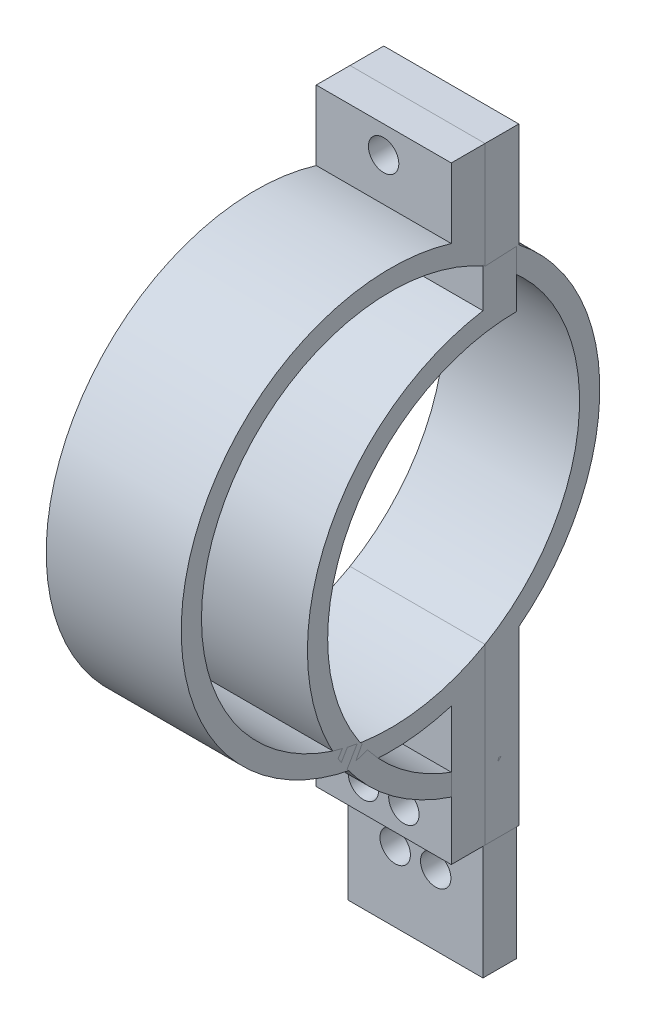
ISO-10303-21;
HEADER;
FILE_DESCRIPTION(('STEP AP214'),'2;1');
FILE_NAME('part.step','',(''),(''),'','','');
FILE_SCHEMA(('AUTOMOTIVE_DESIGN { 1 0 10303 214 1 1 1 1 }'));
ENDSEC;
DATA;
#1=APPLICATION_CONTEXT('core data for automotive mechanical design processes');
#2=APPLICATION_PROTOCOL_DEFINITION('international standard','automotive_design',2000,#1);
#3=PRODUCT_CONTEXT('',#1,'mechanical');
#4=PRODUCT('Part','Part','',(#3));
#5=PRODUCT_RELATED_PRODUCT_CATEGORY('part','',(#4));
#6=PRODUCT_DEFINITION_FORMATION('','',#4);
#7=PRODUCT_DEFINITION_CONTEXT('part definition',#1,'design');
#8=PRODUCT_DEFINITION('design','',#6,#7);
#9=PRODUCT_DEFINITION_SHAPE('','',#8);
#10=(LENGTH_UNIT() NAMED_UNIT(*) SI_UNIT(.MILLI.,.METRE.));
#11=(NAMED_UNIT(*) PLANE_ANGLE_UNIT() SI_UNIT($,.RADIAN.));
#12=(NAMED_UNIT(*) SI_UNIT($,.STERADIAN.) SOLID_ANGLE_UNIT());
#13=UNCERTAINTY_MEASURE_WITH_UNIT(LENGTH_MEASURE(1.E-05),#10,'distance_accuracy_value','');
#14=(GEOMETRIC_REPRESENTATION_CONTEXT(3) GLOBAL_UNCERTAINTY_ASSIGNED_CONTEXT((#13)) GLOBAL_UNIT_ASSIGNED_CONTEXT((#10,
#11,#12)) REPRESENTATION_CONTEXT('',''));
#15=CARTESIAN_POINT('',(0.,0.,0.));
#16=DIRECTION('',(0.,0.,1.));
#17=DIRECTION('',(1.,0.,0.));
#18=AXIS2_PLACEMENT_3D('',#15,#16,#17);
#19=CARTESIAN_POINT('',(20.,0.,4.69181112515571));
#20=DIRECTION('',(0.,0.,-1.));
#21=DIRECTION('',(-1.,0.,0.));
#22=AXIS2_PLACEMENT_3D('',#19,#20,#21);
#23=PLANE('',#22);
#24=CARTESIAN_POINT('',(9.97943321751738,47.895945659677,4.69181112515571));
#25=DIRECTION('',(0.,0.,-1.));
#26=DIRECTION('',(-1.,0.,0.));
#27=AXIS2_PLACEMENT_3D('',#24,#25,#26);
#28=CIRCLE('',#27,2.25);
#29=CARTESIAN_POINT('',(7.72943321751738,47.895945659677,4.69181112515571));
#30=VERTEX_POINT('',#29);
#31=EDGE_CURVE('E185',#30,#30,#28,.T.);
#32=ORIENTED_EDGE('',*,*,#31,.T.);
#33=EDGE_LOOP('',(#32));
#34=FACE_BOUND('',#33,.T.);
#35=DIRECTION('',(0.,-1.,0.));
#36=VECTOR('',#35,1.);
#37=CARTESIAN_POINT('',(0.,0.,4.69181112515571));
#38=LINE('',#37,#36);
#39=CARTESIAN_POINT('',(0.,51.895945659677,4.69181112515571));
#40=VERTEX_POINT('',#39);
#41=CARTESIAN_POINT('',(0.,36.1446569656412,4.69181112515571));
#42=VERTEX_POINT('',#41);
#43=EDGE_CURVE('E155',#40,#42,#38,.T.);
#44=ORIENTED_EDGE('',*,*,#43,.T.);
#45=DIRECTION('',(-1.,0.,0.));
#46=VECTOR('',#45,1.);
#47=CARTESIAN_POINT('',(20.,36.1446569656412,4.69181112515571));
#48=LINE('',#47,#46);
#49=CARTESIAN_POINT('',(20.,36.1446569656412,4.69181112515571));
#50=VERTEX_POINT('',#49);
#51=EDGE_CURVE('E12',#50,#42,#48,.T.);
#52=ORIENTED_EDGE('',*,*,#51,.F.);
#53=DIRECTION('',(0.,-1.,0.));
#54=VECTOR('',#53,1.);
#55=CARTESIAN_POINT('',(20.,0.,4.69181112515571));
#56=LINE('',#55,#54);
#57=CARTESIAN_POINT('',(20.,51.895945659677,4.69181112515571));
#58=VERTEX_POINT('',#57);
#59=EDGE_CURVE('E114',#58,#50,#56,.T.);
#60=ORIENTED_EDGE('',*,*,#59,.F.);
#61=DIRECTION('',(-1.,0.,0.));
#62=VECTOR('',#61,1.);
#63=CARTESIAN_POINT('',(20.,51.895945659677,4.69181112515571));
#64=LINE('',#63,#62);
#65=EDGE_CURVE('E76',#58,#40,#64,.T.);
#66=ORIENTED_EDGE('',*,*,#65,.T.);
#67=EDGE_LOOP('',(#44,#52,#60,#66));
#68=FACE_BOUND('',#67,.T.);
#69=ADVANCED_FACE('F58',(#34,#68),#23,.F.);
#70=CARTESIAN_POINT('',(20.,11.895945659677,18.6918111251557));
#71=DIRECTION('',(-1.,0.,0.));
#72=DIRECTION('',(0.,0.,1.));
#73=AXIS2_PLACEMENT_3D('',#70,#71,#72);
#74=CYLINDRICAL_SURFACE('',#73,28.);
#75=CARTESIAN_POINT('',(0.,11.895945659677,18.6918111251557));
#76=DIRECTION('',(1.,0.,0.));
#77=DIRECTION('',(0.,0.,-1.));
#78=AXIS2_PLACEMENT_3D('',#75,#76,#77);
#79=CIRCLE('',#78,28.);
#80=CARTESIAN_POINT('',(0.,-12.3527656462873,4.69181112515571));
#81=VERTEX_POINT('',#80);
#82=EDGE_CURVE('E157',#81,#42,#79,.T.);
#83=ORIENTED_EDGE('',*,*,#82,.F.);
#84=DIRECTION('',(-1.,0.,0.));
#85=VECTOR('',#84,1.);
#86=CARTESIAN_POINT('',(20.,-12.3527656462873,4.69181112515571));
#87=LINE('',#86,#85);
#88=CARTESIAN_POINT('',(20.,-12.3527656462873,4.69181112515571));
#89=VERTEX_POINT('',#88);
#90=EDGE_CURVE('E67',#89,#81,#87,.T.);
#91=ORIENTED_EDGE('',*,*,#90,.F.);
#92=CARTESIAN_POINT('',(20.,11.895945659677,18.6918111251557));
#93=DIRECTION('',(1.,0.,0.));
#94=DIRECTION('',(0.,0.,-1.));
#95=AXIS2_PLACEMENT_3D('',#92,#93,#94);
#96=CIRCLE('',#95,28.);
#97=EDGE_CURVE('E201',#89,#50,#96,.T.);
#98=ORIENTED_EDGE('',*,*,#97,.T.);
#99=ORIENTED_EDGE('',*,*,#51,.T.);
#100=EDGE_LOOP('',(#83,#91,#98,#99));
#101=FACE_BOUND('',#100,.T.);
#102=ADVANCED_FACE('F232',(#101),#74,.F.);
#103=CARTESIAN_POINT('',(20.,0.,4.69181112515571));
#104=DIRECTION('',(0.,0.,-1.));
#105=DIRECTION('',(-1.,0.,0.));
#106=AXIS2_PLACEMENT_3D('',#103,#104,#105);
#107=PLANE('',#106);
#108=CARTESIAN_POINT('',(6.97943321751738,-34.0266817201343,4.69181112515571));
#109=DIRECTION('',(0.,0.,-1.));
#110=DIRECTION('',(-1.,0.,0.));
#111=AXIS2_PLACEMENT_3D('',#108,#109,#110);
#112=CIRCLE('',#111,2.25000000000001);
#113=CARTESIAN_POINT('',(4.72943321751738,-34.0266817201343,4.69181112515571));
#114=VERTEX_POINT('',#113);
#115=EDGE_CURVE('E158',#114,#114,#112,.T.);
#116=ORIENTED_EDGE('',*,*,#115,.T.);
#117=EDGE_LOOP('',(#116));
#118=FACE_BOUND('',#117,.T.);
#119=CARTESIAN_POINT('',(12.9794332175174,-34.104054340323,4.69181112515571));
#120=DIRECTION('',(0.,0.,-1.));
#121=DIRECTION('',(-1.,0.,0.));
#122=AXIS2_PLACEMENT_3D('',#119,#120,#121);
#123=CIRCLE('',#122,2.25);
#124=CARTESIAN_POINT('',(10.7294332175174,-34.104054340323,4.69181112515571));
#125=VERTEX_POINT('',#124);
#126=EDGE_CURVE('E188',#125,#125,#123,.T.);
#127=ORIENTED_EDGE('',*,*,#126,.T.);
#128=EDGE_LOOP('',(#127));
#129=FACE_BOUND('',#128,.T.);
#130=DIRECTION('',(0.,-1.,0.));
#131=VECTOR('',#130,1.);
#132=CARTESIAN_POINT('',(0.,0.,4.69181112515571));
#133=LINE('',#132,#131);
#134=CARTESIAN_POINT('',(0.,-38.104054340323,4.69181112515571));
#135=VERTEX_POINT('',#134);
#136=EDGE_CURVE('E161',#81,#135,#133,.T.);
#137=ORIENTED_EDGE('',*,*,#136,.T.);
#138=DIRECTION('',(-1.,0.,0.));
#139=VECTOR('',#138,1.);
#140=CARTESIAN_POINT('',(20.,-38.104054340323,4.69181112515571));
#141=LINE('',#140,#139);
#142=CARTESIAN_POINT('',(20.,-38.104054340323,4.69181112515571));
#143=VERTEX_POINT('',#142);
#144=EDGE_CURVE('E179',#143,#135,#141,.T.);
#145=ORIENTED_EDGE('',*,*,#144,.F.);
#146=DIRECTION('',(0.,-1.,0.));
#147=VECTOR('',#146,1.);
#148=CARTESIAN_POINT('',(20.,0.,4.69181112515571));
#149=LINE('',#148,#147);
#150=EDGE_CURVE('E204',#89,#143,#149,.T.);
#151=ORIENTED_EDGE('',*,*,#150,.F.);
#152=ORIENTED_EDGE('',*,*,#90,.T.);
#153=EDGE_LOOP('',(#137,#145,#151,#152));
#154=FACE_BOUND('',#153,.T.);
#155=ADVANCED_FACE('F238',(#118,#129,#154),#107,.F.);
#156=CARTESIAN_POINT('',(20.,-38.104054340323,0.));
#157=DIRECTION('',(0.,1.,0.));
#158=DIRECTION('',(0.,0.,1.));
#159=AXIS2_PLACEMENT_3D('',#156,#157,#158);
#160=PLANE('',#159);
#161=DIRECTION('',(0.,0.,-1.));
#162=VECTOR('',#161,1.);
#163=CARTESIAN_POINT('',(0.,-38.104054340323,0.));
#164=LINE('',#163,#162);
#165=CARTESIAN_POINT('',(0.,-38.104054340323,-0.308188874844293));
#166=VERTEX_POINT('',#165);
#167=EDGE_CURVE('E163',#135,#166,#164,.T.);
#168=ORIENTED_EDGE('',*,*,#167,.T.);
#169=DIRECTION('',(-1.,0.,0.));
#170=VECTOR('',#169,1.);
#171=CARTESIAN_POINT('',(20.,-38.104054340323,-0.308188874844293));
#172=LINE('',#171,#170);
#173=CARTESIAN_POINT('',(20.,-38.104054340323,-0.308188874844293));
#174=VERTEX_POINT('',#173);
#175=EDGE_CURVE('E176',#174,#166,#172,.T.);
#176=ORIENTED_EDGE('',*,*,#175,.F.);
#177=DIRECTION('',(0.,0.,-1.));
#178=VECTOR('',#177,1.);
#179=CARTESIAN_POINT('',(20.,-38.104054340323,0.));
#180=LINE('',#179,#178);
#181=EDGE_CURVE('E206',#143,#174,#180,.T.);
#182=ORIENTED_EDGE('',*,*,#181,.F.);
#183=ORIENTED_EDGE('',*,*,#144,.T.);
#184=EDGE_LOOP('',(#168,#176,#182,#183));
#185=FACE_BOUND('',#184,.T.);
#186=ADVANCED_FACE('F212',(#185),#160,.F.);
#187=CARTESIAN_POINT('',(20.,0.,-0.308188874844293));
#188=DIRECTION('',(0.,0.,1.));
#189=DIRECTION('',(1.,0.,0.));
#190=AXIS2_PLACEMENT_3D('',#187,#188,#189);
#191=PLANE('',#190);
#192=CARTESIAN_POINT('',(6.97943321751738,-34.0266817201343,-0.308188874844293));
#193=DIRECTION('',(0.,0.,1.));
#194=DIRECTION('',(1.,0.,0.));
#195=AXIS2_PLACEMENT_3D('',#192,#193,#194);
#196=CIRCLE('',#195,2.25000000000001);
#197=CARTESIAN_POINT('',(9.22943321751739,-34.0266817201343,-0.308188874844293));
#198=VERTEX_POINT('',#197);
#199=EDGE_CURVE('E61',#198,#198,#196,.T.);
#200=ORIENTED_EDGE('',*,*,#199,.T.);
#201=EDGE_LOOP('',(#200));
#202=FACE_BOUND('',#201,.T.);
#203=CARTESIAN_POINT('',(12.9794332175174,-34.104054340323,-0.308188874844293));
#204=DIRECTION('',(0.,0.,1.));
#205=DIRECTION('',(1.,0.,0.));
#206=AXIS2_PLACEMENT_3D('',#203,#204,#205);
#207=CIRCLE('',#206,2.25);
#208=CARTESIAN_POINT('',(15.2294332175174,-34.104054340323,-0.308188874844293));
#209=VERTEX_POINT('',#208);
#210=EDGE_CURVE('E186',#209,#209,#207,.T.);
#211=ORIENTED_EDGE('',*,*,#210,.T.);
#212=EDGE_LOOP('',(#211));
#213=FACE_BOUND('',#212,.T.);
#214=DIRECTION('',(0.,1.,0.));
#215=VECTOR('',#214,1.);
#216=CARTESIAN_POINT('',(0.,0.,-0.308188874844293));
#217=LINE('',#216,#215);
#218=CARTESIAN_POINT('',(0.,-12.5989517681548,-0.308188874844295));
#219=VERTEX_POINT('',#218);
#220=EDGE_CURVE('E165',#166,#219,#217,.T.);
#221=ORIENTED_EDGE('',*,*,#220,.T.);
#222=DIRECTION('',(-1.,0.,0.));
#223=VECTOR('',#222,1.);
#224=CARTESIAN_POINT('',(20.,-12.5989517681548,-0.308188874844295));
#225=LINE('',#224,#223);
#226=CARTESIAN_POINT('',(20.,-12.5989517681548,-0.308188874844295));
#227=VERTEX_POINT('',#226);
#228=EDGE_CURVE('E147',#227,#219,#225,.T.);
#229=ORIENTED_EDGE('',*,*,#228,.F.);
#230=DIRECTION('',(0.,1.,0.));
#231=VECTOR('',#230,1.);
#232=CARTESIAN_POINT('',(20.,0.,-0.308188874844293));
#233=LINE('',#232,#231);
#234=EDGE_CURVE('E135',#174,#227,#233,.T.);
#235=ORIENTED_EDGE('',*,*,#234,.F.);
#236=ORIENTED_EDGE('',*,*,#175,.T.);
#237=EDGE_LOOP('',(#221,#229,#235,#236));
#238=FACE_BOUND('',#237,.T.);
#239=ADVANCED_FACE('F216',(#202,#213,#238),#191,.F.);
#240=CARTESIAN_POINT('',(20.,11.895945659677,18.6918111251557));
#241=DIRECTION('',(-1.,0.,0.));
#242=DIRECTION('',(0.,0.,1.));
#243=AXIS2_PLACEMENT_3D('',#240,#241,#242);
#244=CYLINDRICAL_SURFACE('',#243,31.);
#245=CARTESIAN_POINT('',(0.,11.895945659677,18.6918111251557));
#246=DIRECTION('',(1.,0.,0.));
#247=DIRECTION('',(0.,0.,-1.));
#248=AXIS2_PLACEMENT_3D('',#245,#246,#247);
#249=CIRCLE('',#248,31.);
#250=CARTESIAN_POINT('',(0.,36.3908430875087,-0.308188874844295));
#251=VERTEX_POINT('',#250);
#252=EDGE_CURVE('E144',#219,#251,#249,.T.);
#253=ORIENTED_EDGE('',*,*,#252,.T.);
#254=DIRECTION('',(-1.,0.,0.));
#255=VECTOR('',#254,1.);
#256=CARTESIAN_POINT('',(20.,36.3908430875087,-0.308188874844295));
#257=LINE('',#256,#255);
#258=CARTESIAN_POINT('',(20.,36.3908430875087,-0.308188874844295));
#259=VERTEX_POINT('',#258);
#260=EDGE_CURVE('E141',#259,#251,#257,.T.);
#261=ORIENTED_EDGE('',*,*,#260,.F.);
#262=CARTESIAN_POINT('',(20.,11.895945659677,18.6918111251557));
#263=DIRECTION('',(1.,0.,0.));
#264=DIRECTION('',(0.,0.,-1.));
#265=AXIS2_PLACEMENT_3D('',#262,#263,#264);
#266=CIRCLE('',#265,31.);
#267=EDGE_CURVE('E129',#227,#259,#266,.T.);
#268=ORIENTED_EDGE('',*,*,#267,.F.);
#269=ORIENTED_EDGE('',*,*,#228,.T.);
#270=EDGE_LOOP('',(#253,#261,#268,#269));
#271=FACE_BOUND('',#270,.T.);
#272=ADVANCED_FACE('F142',(#271),#244,.T.);
#273=CARTESIAN_POINT('',(20.,0.,-0.308188874844293));
#274=DIRECTION('',(0.,0.,1.));
#275=DIRECTION('',(1.,0.,0.));
#276=AXIS2_PLACEMENT_3D('',#273,#274,#275);
#277=PLANE('',#276);
#278=CARTESIAN_POINT('',(9.97943321751738,47.895945659677,-0.308188874844293));
#279=DIRECTION('',(0.,0.,1.));
#280=DIRECTION('',(1.,0.,0.));
#281=AXIS2_PLACEMENT_3D('',#278,#279,#280);
#282=CIRCLE('',#281,2.25);
#283=CARTESIAN_POINT('',(12.2294332175174,47.895945659677,-0.308188874844293));
#284=VERTEX_POINT('',#283);
#285=EDGE_CURVE('E183',#284,#284,#282,.T.);
#286=ORIENTED_EDGE('',*,*,#285,.T.);
#287=EDGE_LOOP('',(#286));
#288=FACE_BOUND('',#287,.T.);
#289=DIRECTION('',(0.,1.,0.));
#290=VECTOR('',#289,1.);
#291=CARTESIAN_POINT('',(0.,0.,-0.308188874844293));
#292=LINE('',#291,#290);
#293=CARTESIAN_POINT('',(0.,51.895945659677,-0.308188874844293));
#294=VERTEX_POINT('',#293);
#295=EDGE_CURVE('E168',#251,#294,#292,.T.);
#296=ORIENTED_EDGE('',*,*,#295,.T.);
#297=DIRECTION('',(-1.,0.,0.));
#298=VECTOR('',#297,1.);
#299=CARTESIAN_POINT('',(20.,51.895945659677,-0.308188874844293));
#300=LINE('',#299,#298);
#301=CARTESIAN_POINT('',(20.,51.895945659677,-0.308188874844293));
#302=VERTEX_POINT('',#301);
#303=EDGE_CURVE('E102',#302,#294,#300,.T.);
#304=ORIENTED_EDGE('',*,*,#303,.F.);
#305=DIRECTION('',(0.,1.,0.));
#306=VECTOR('',#305,1.);
#307=CARTESIAN_POINT('',(20.,0.,-0.308188874844293));
#308=LINE('',#307,#306);
#309=EDGE_CURVE('E133',#259,#302,#308,.T.);
#310=ORIENTED_EDGE('',*,*,#309,.F.);
#311=ORIENTED_EDGE('',*,*,#260,.T.);
#312=EDGE_LOOP('',(#296,#304,#310,#311));
#313=FACE_BOUND('',#312,.T.);
#314=ADVANCED_FACE('F149',(#288,#313),#277,.F.);
#315=CARTESIAN_POINT('',(20.,51.895945659677,0.));
#316=DIRECTION('',(0.,1.,0.));
#317=DIRECTION('',(0.,0.,1.));
#318=AXIS2_PLACEMENT_3D('',#315,#316,#317);
#319=PLANE('',#318);
#320=DIRECTION('',(0.,0.,-1.));
#321=VECTOR('',#320,1.);
#322=CARTESIAN_POINT('',(0.,51.895945659677,0.));
#323=LINE('',#322,#321);
#324=EDGE_CURVE('E170',#40,#294,#323,.T.);
#325=ORIENTED_EDGE('',*,*,#324,.F.);
#326=ORIENTED_EDGE('',*,*,#65,.F.);
#327=DIRECTION('',(0.,0.,-1.));
#328=VECTOR('',#327,1.);
#329=CARTESIAN_POINT('',(20.,51.895945659677,0.));
#330=LINE('',#329,#328);
#331=EDGE_CURVE('E150',#58,#302,#330,.T.);
#332=ORIENTED_EDGE('',*,*,#331,.T.);
#333=ORIENTED_EDGE('',*,*,#303,.T.);
#334=EDGE_LOOP('',(#325,#326,#332,#333));
#335=FACE_BOUND('',#334,.T.);
#336=ADVANCED_FACE('F219',(#335),#319,.T.);
#337=CARTESIAN_POINT('',(20.,0.,0.));
#338=DIRECTION('',(1.,0.,0.));
#339=DIRECTION('',(0.,0.,-1.));
#340=AXIS2_PLACEMENT_3D('',#337,#338,#339);
#341=PLANE('',#340);
#342=ORIENTED_EDGE('',*,*,#59,.T.);
#343=ORIENTED_EDGE('',*,*,#97,.F.);
#344=ORIENTED_EDGE('',*,*,#150,.T.);
#345=ORIENTED_EDGE('',*,*,#181,.T.);
#346=ORIENTED_EDGE('',*,*,#234,.T.);
#347=ORIENTED_EDGE('',*,*,#267,.T.);
#348=ORIENTED_EDGE('',*,*,#309,.T.);
#349=ORIENTED_EDGE('',*,*,#331,.F.);
#350=EDGE_LOOP('',(#342,#343,#344,#345,#346,#347,#348,#349));
#351=FACE_BOUND('',#350,.T.);
#352=ADVANCED_FACE('F131',(#351),#341,.T.);
#353=CARTESIAN_POINT('',(0.,0.,0.));
#354=DIRECTION('',(1.,0.,0.));
#355=DIRECTION('',(0.,0.,-1.));
#356=AXIS2_PLACEMENT_3D('',#353,#354,#355);
#357=PLANE('',#356);
#358=ORIENTED_EDGE('',*,*,#43,.F.);
#359=ORIENTED_EDGE('',*,*,#324,.T.);
#360=ORIENTED_EDGE('',*,*,#295,.F.);
#361=ORIENTED_EDGE('',*,*,#252,.F.);
#362=ORIENTED_EDGE('',*,*,#220,.F.);
#363=ORIENTED_EDGE('',*,*,#167,.F.);
#364=ORIENTED_EDGE('',*,*,#136,.F.);
#365=ORIENTED_EDGE('',*,*,#82,.T.);
#366=EDGE_LOOP('',(#358,#359,#360,#361,#362,#363,#364,#365));
#367=FACE_BOUND('',#366,.T.);
#368=ADVANCED_FACE('F218',(#367),#357,.F.);
#369=CARTESIAN_POINT('',(9.97943321751738,47.895945659677,-10.3081888748443));
#370=DIRECTION('',(0.,0.,1.));
#371=DIRECTION('',(1.,0.,0.));
#372=AXIS2_PLACEMENT_3D('',#369,#370,#371);
#373=CYLINDRICAL_SURFACE('',#372,2.25);
#374=ORIENTED_EDGE('',*,*,#285,.F.);
#375=EDGE_LOOP('',(#374));
#376=FACE_BOUND('',#375,.T.);
#377=ORIENTED_EDGE('',*,*,#31,.F.);
#378=EDGE_LOOP('',(#377));
#379=FACE_BOUND('',#378,.T.);
#380=ADVANCED_FACE('F303',(#376,#379),#373,.F.);
#381=CARTESIAN_POINT('',(12.9794332175174,-34.104054340323,-10.3081888748443));
#382=DIRECTION('',(0.,0.,1.));
#383=DIRECTION('',(1.,0.,0.));
#384=AXIS2_PLACEMENT_3D('',#381,#382,#383);
#385=CYLINDRICAL_SURFACE('',#384,2.25);
#386=ORIENTED_EDGE('',*,*,#210,.F.);
#387=EDGE_LOOP('',(#386));
#388=FACE_BOUND('',#387,.T.);
#389=ORIENTED_EDGE('',*,*,#126,.F.);
#390=EDGE_LOOP('',(#389));
#391=FACE_BOUND('',#390,.T.);
#392=ADVANCED_FACE('F312',(#388,#391),#385,.F.);
#393=CARTESIAN_POINT('',(6.97943321751738,-34.0266817201343,-10.3081888748443));
#394=DIRECTION('',(0.,0.,1.));
#395=DIRECTION('',(1.,0.,0.));
#396=AXIS2_PLACEMENT_3D('',#393,#394,#395);
#397=CYLINDRICAL_SURFACE('',#396,2.25000000000001);
#398=ORIENTED_EDGE('',*,*,#199,.F.);
#399=EDGE_LOOP('',(#398));
#400=FACE_BOUND('',#399,.T.);
#401=ORIENTED_EDGE('',*,*,#115,.F.);
#402=EDGE_LOOP('',(#401));
#403=FACE_BOUND('',#402,.T.);
#404=ADVANCED_FACE('F322',(#400,#403),#397,.F.);
#405=CLOSED_SHELL('',(#69,#102,#155,#186,#239,#272,#314,#336,#352,#368,#380,#392,#404));
#406=MANIFOLD_SOLID_BREP('B2',#405);
#407=CARTESIAN_POINT('',(20.,0.,4.69181112515571));
#408=DIRECTION('',(0.,0.,-1.));
#409=DIRECTION('',(-1.,0.,0.));
#410=AXIS2_PLACEMENT_3D('',#407,#408,#409);
#411=PLANE('',#410);
#412=CARTESIAN_POINT('',(6.97943321751738,-34.0266817201343,4.69181112515571));
#413=DIRECTION('',(0.,0.,-1.));
#414=DIRECTION('',(-1.,0.,0.));
#415=AXIS2_PLACEMENT_3D('',#412,#413,#414);
#416=CIRCLE('',#415,2.25000000000001);
#417=CARTESIAN_POINT('',(4.72943321751738,-34.0266817201343,4.69181112515571));
#418=VERTEX_POINT('',#417);
#419=EDGE_CURVE('E533',#418,#418,#416,.T.);
#420=ORIENTED_EDGE('',*,*,#419,.F.);
#421=EDGE_LOOP('',(#420));
#422=FACE_BOUND('',#421,.T.);
#423=CARTESIAN_POINT('',(12.9794332175174,-34.104054340323,4.69181112515571));
#424=DIRECTION('',(0.,0.,-1.));
#425=DIRECTION('',(-1.,0.,0.));
#426=AXIS2_PLACEMENT_3D('',#423,#424,#425);
#427=CIRCLE('',#426,2.25);
#428=CARTESIAN_POINT('',(10.7294332175174,-34.104054340323,4.69181112515571));
#429=VERTEX_POINT('',#428);
#430=EDGE_CURVE('E536',#429,#429,#427,.T.);
#431=ORIENTED_EDGE('',*,*,#430,.F.);
#432=EDGE_LOOP('',(#431));
#433=FACE_BOUND('',#432,.T.);
#434=DIRECTION('',(0.,-1.,0.));
#435=VECTOR('',#434,1.);
#436=CARTESIAN_POINT('',(0.,0.,4.69181112515571));
#437=LINE('',#436,#435);
#438=CARTESIAN_POINT('',(0.,-12.3527656462873,4.69181112515571));
#439=VERTEX_POINT('',#438);
#440=CARTESIAN_POINT('',(0.,-38.104054340323,4.69181112515571));
#441=VERTEX_POINT('',#440);
#442=EDGE_CURVE('E475',#439,#441,#437,.T.);
#443=ORIENTED_EDGE('',*,*,#442,.F.);
#444=DIRECTION('',(-1.,0.,0.));
#445=VECTOR('',#444,1.);
#446=CARTESIAN_POINT('',(20.,-12.3527656462873,4.69181112515571));
#447=LINE('',#446,#445);
#448=CARTESIAN_POINT('',(20.,-12.3527656462873,4.69181112515571));
#449=VERTEX_POINT('',#448);
#450=EDGE_CURVE('E56',#449,#439,#447,.T.);
#451=ORIENTED_EDGE('',*,*,#450,.F.);
#452=DIRECTION('',(0.,-1.,0.));
#453=VECTOR('',#452,1.);
#454=CARTESIAN_POINT('',(20.,0.,4.69181112515571));
#455=LINE('',#454,#453);
#456=CARTESIAN_POINT('',(20.,-38.104054340323,4.69181112515571));
#457=VERTEX_POINT('',#456);
#458=EDGE_CURVE('E496',#449,#457,#455,.T.);
#459=ORIENTED_EDGE('',*,*,#458,.T.);
#460=DIRECTION('',(-1.,0.,0.));
#461=VECTOR('',#460,1.);
#462=CARTESIAN_POINT('',(20.,-38.104054340323,4.69181112515571));
#463=LINE('',#462,#461);
#464=EDGE_CURVE('E432',#457,#441,#463,.T.);
#465=ORIENTED_EDGE('',*,*,#464,.T.);
#466=EDGE_LOOP('',(#443,#451,#459,#465));
#467=FACE_BOUND('',#466,.T.);
#468=ADVANCED_FACE('F382',(#422,#433,#467),#411,.T.);
#469=CARTESIAN_POINT('',(20.,11.895945659677,18.6918111251557));
#470=DIRECTION('',(-1.,0.,0.));
#471=DIRECTION('',(0.,0.,1.));
#472=AXIS2_PLACEMENT_3D('',#469,#470,#471);
#473=CYLINDRICAL_SURFACE('',#472,28.);
#474=CARTESIAN_POINT('',(0.,11.895945659677,18.6918111251557));
#475=DIRECTION('',(1.,0.,0.));
#476=DIRECTION('',(0.,0.,-1.));
#477=AXIS2_PLACEMENT_3D('',#474,#475,#476);
#478=CIRCLE('',#477,28.);
#479=CARTESIAN_POINT('',(0.,36.1446569656412,4.69181112515571));
#480=VERTEX_POINT('',#479);
#481=EDGE_CURVE('E478',#480,#439,#478,.T.);
#482=ORIENTED_EDGE('',*,*,#481,.F.);
#483=DIRECTION('',(-1.,0.,0.));
#484=VECTOR('',#483,1.);
#485=CARTESIAN_POINT('',(20.,36.1446569656412,4.69181112515571));
#486=LINE('',#485,#484);
#487=CARTESIAN_POINT('',(20.,36.1446569656412,4.69181112515571));
#488=VERTEX_POINT('',#487);
#489=EDGE_CURVE('E390',#488,#480,#486,.T.);
#490=ORIENTED_EDGE('',*,*,#489,.F.);
#491=CARTESIAN_POINT('',(20.,11.895945659677,18.6918111251557));
#492=DIRECTION('',(1.,0.,0.));
#493=DIRECTION('',(0.,0.,-1.));
#494=AXIS2_PLACEMENT_3D('',#491,#492,#493);
#495=CIRCLE('',#494,28.);
#496=EDGE_CURVE('E522',#488,#449,#495,.T.);
#497=ORIENTED_EDGE('',*,*,#496,.T.);
#498=ORIENTED_EDGE('',*,*,#450,.T.);
#499=EDGE_LOOP('',(#482,#490,#497,#498));
#500=FACE_BOUND('',#499,.T.);
#501=ADVANCED_FACE('F513',(#500),#473,.F.);
#502=CARTESIAN_POINT('',(20.,0.,4.69181112515571));
#503=DIRECTION('',(0.,0.,-1.));
#504=DIRECTION('',(-1.,0.,0.));
#505=AXIS2_PLACEMENT_3D('',#502,#503,#504);
#506=PLANE('',#505);
#507=CARTESIAN_POINT('',(9.97943321751738,47.895945659677,4.69181112515571));
#508=DIRECTION('',(0.,0.,-1.));
#509=DIRECTION('',(-1.,0.,0.));
#510=AXIS2_PLACEMENT_3D('',#507,#508,#509);
#511=CIRCLE('',#510,2.25);
#512=CARTESIAN_POINT('',(7.72943321751738,47.895945659677,4.69181112515571));
#513=VERTEX_POINT('',#512);
#514=EDGE_CURVE('E479',#513,#513,#511,.T.);
#515=ORIENTED_EDGE('',*,*,#514,.F.);
#516=EDGE_LOOP('',(#515));
#517=FACE_BOUND('',#516,.T.);
#518=DIRECTION('',(0.,-1.,0.));
#519=VECTOR('',#518,1.);
#520=CARTESIAN_POINT('',(0.,0.,4.69181112515571));
#521=LINE('',#520,#519);
#522=CARTESIAN_POINT('',(0.,51.895945659677,4.69181112515571));
#523=VERTEX_POINT('',#522);
#524=EDGE_CURVE('E482',#523,#480,#521,.T.);
#525=ORIENTED_EDGE('',*,*,#524,.F.);
#526=DIRECTION('',(-1.,0.,0.));
#527=VECTOR('',#526,1.);
#528=CARTESIAN_POINT('',(20.,51.895945659677,4.69181112515571));
#529=LINE('',#528,#527);
#530=CARTESIAN_POINT('',(20.,51.895945659677,4.69181112515571));
#531=VERTEX_POINT('',#530);
#532=EDGE_CURVE('E502',#531,#523,#529,.T.);
#533=ORIENTED_EDGE('',*,*,#532,.F.);
#534=DIRECTION('',(0.,-1.,0.));
#535=VECTOR('',#534,1.);
#536=CARTESIAN_POINT('',(20.,0.,4.69181112515571));
#537=LINE('',#536,#535);
#538=EDGE_CURVE('E509',#531,#488,#537,.T.);
#539=ORIENTED_EDGE('',*,*,#538,.T.);
#540=ORIENTED_EDGE('',*,*,#489,.T.);
#541=EDGE_LOOP('',(#525,#533,#539,#540));
#542=FACE_BOUND('',#541,.T.);
#543=ADVANCED_FACE('F507',(#517,#542),#506,.T.);
#544=CARTESIAN_POINT('',(20.,51.895945659677,0.));
#545=DIRECTION('',(0.,1.,0.));
#546=DIRECTION('',(0.,0.,1.));
#547=AXIS2_PLACEMENT_3D('',#544,#545,#546);
#548=PLANE('',#547);
#549=DIRECTION('',(0.,0.,-1.));
#550=VECTOR('',#549,1.);
#551=CARTESIAN_POINT('',(0.,51.895945659677,0.));
#552=LINE('',#551,#550);
#553=CARTESIAN_POINT('',(0.,51.895945659677,9.69181112515571));
#554=VERTEX_POINT('',#553);
#555=EDGE_CURVE('E485',#554,#523,#552,.T.);
#556=ORIENTED_EDGE('',*,*,#555,.F.);
#557=DIRECTION('',(-1.,0.,0.));
#558=VECTOR('',#557,1.);
#559=CARTESIAN_POINT('',(20.,51.895945659677,9.69181112515571));
#560=LINE('',#559,#558);
#561=CARTESIAN_POINT('',(20.,51.895945659677,9.69181112515571));
#562=VERTEX_POINT('',#561);
#563=EDGE_CURVE('E500',#562,#554,#560,.T.);
#564=ORIENTED_EDGE('',*,*,#563,.F.);
#565=DIRECTION('',(0.,0.,-1.));
#566=VECTOR('',#565,1.);
#567=CARTESIAN_POINT('',(20.,51.895945659677,0.));
#568=LINE('',#567,#566);
#569=EDGE_CURVE('E521',#562,#531,#568,.T.);
#570=ORIENTED_EDGE('',*,*,#569,.T.);
#571=ORIENTED_EDGE('',*,*,#532,.T.);
#572=EDGE_LOOP('',(#556,#564,#570,#571));
#573=FACE_BOUND('',#572,.T.);
#574=ADVANCED_FACE('F519',(#573),#548,.T.);
#575=CARTESIAN_POINT('',(20.,0.,9.69181112515571));
#576=DIRECTION('',(0.,0.,1.));
#577=DIRECTION('',(0.,-1.,0.));
#578=AXIS2_PLACEMENT_3D('',#575,#576,#577);
#579=PLANE('',#578);
#580=CARTESIAN_POINT('',(9.97943321751738,47.895945659677,9.69181112515571));
#581=DIRECTION('',(0.,0.,1.));
#582=DIRECTION('',(-1.,0.,0.));
#583=AXIS2_PLACEMENT_3D('',#580,#581,#582);
#584=CIRCLE('',#583,2.25);
#585=CARTESIAN_POINT('',(7.72943321751738,47.895945659677,9.69181112515571));
#586=VERTEX_POINT('',#585);
#587=EDGE_CURVE('E543',#586,#586,#584,.T.);
#588=ORIENTED_EDGE('',*,*,#587,.F.);
#589=EDGE_LOOP('',(#588));
#590=FACE_BOUND('',#589,.T.);
#591=DIRECTION('',(0.,1.,0.));
#592=VECTOR('',#591,1.);
#593=CARTESIAN_POINT('',(0.,0.,9.69181112515571));
#594=LINE('',#593,#592);
#595=CARTESIAN_POINT('',(0.,41.5607396080596,9.69181112515571));
#596=VERTEX_POINT('',#595);
#597=EDGE_CURVE('E488',#596,#554,#594,.T.);
#598=ORIENTED_EDGE('',*,*,#597,.F.);
#599=DIRECTION('',(-1.,0.,0.));
#600=VECTOR('',#599,1.);
#601=CARTESIAN_POINT('',(20.,41.5607396080596,9.69181112515571));
#602=LINE('',#601,#600);
#603=CARTESIAN_POINT('',(20.,41.5607396080596,9.69181112515571));
#604=VERTEX_POINT('',#603);
#605=EDGE_CURVE('E468',#604,#596,#602,.T.);
#606=ORIENTED_EDGE('',*,*,#605,.F.);
#607=DIRECTION('',(0.,1.,0.));
#608=VECTOR('',#607,1.);
#609=CARTESIAN_POINT('',(20.,0.,9.69181112515571));
#610=LINE('',#609,#608);
#611=EDGE_CURVE('E457',#604,#562,#610,.T.);
#612=ORIENTED_EDGE('',*,*,#611,.T.);
#613=ORIENTED_EDGE('',*,*,#563,.T.);
#614=EDGE_LOOP('',(#598,#606,#612,#613));
#615=FACE_BOUND('',#614,.T.);
#616=ADVANCED_FACE('F528',(#590,#615),#579,.T.);
#617=CARTESIAN_POINT('',(20.,11.895945659677,18.6918111251557));
#618=DIRECTION('',(-1.,0.,0.));
#619=DIRECTION('',(0.,0.,1.));
#620=AXIS2_PLACEMENT_3D('',#617,#618,#619);
#621=CYLINDRICAL_SURFACE('',#620,31.);
#622=CARTESIAN_POINT('',(0.,11.895945659677,18.6918111251557));
#623=DIRECTION('',(1.,0.,0.));
#624=DIRECTION('',(0.,0.,-1.));
#625=AXIS2_PLACEMENT_3D('',#622,#623,#624);
#626=CIRCLE('',#625,31.);
#627=CARTESIAN_POINT('',(0.,-17.7688482887057,9.69181112515571));
#628=VERTEX_POINT('',#627);
#629=EDGE_CURVE('E464',#596,#628,#626,.T.);
#630=ORIENTED_EDGE('',*,*,#629,.T.);
#631=DIRECTION('',(-1.,0.,0.));
#632=VECTOR('',#631,1.);
#633=CARTESIAN_POINT('',(20.,-17.7688482887057,9.69181112515571));
#634=LINE('',#633,#632);
#635=CARTESIAN_POINT('',(20.,-17.7688482887057,9.69181112515571));
#636=VERTEX_POINT('',#635);
#637=EDGE_CURVE('E461',#636,#628,#634,.T.);
#638=ORIENTED_EDGE('',*,*,#637,.F.);
#639=CARTESIAN_POINT('',(20.,11.895945659677,18.6918111251557));
#640=DIRECTION('',(1.,0.,0.));
#641=DIRECTION('',(0.,0.,-1.));
#642=AXIS2_PLACEMENT_3D('',#639,#640,#641);
#643=CIRCLE('',#642,31.);
#644=EDGE_CURVE('E450',#604,#636,#643,.T.);
#645=ORIENTED_EDGE('',*,*,#644,.F.);
#646=ORIENTED_EDGE('',*,*,#605,.T.);
#647=EDGE_LOOP('',(#630,#638,#645,#646));
#648=FACE_BOUND('',#647,.T.);
#649=ADVANCED_FACE('F462',(#648),#621,.T.);
#650=CARTESIAN_POINT('',(20.,0.,9.69181112515571));
#651=DIRECTION('',(0.,0.,1.));
#652=DIRECTION('',(0.,-1.,0.));
#653=AXIS2_PLACEMENT_3D('',#650,#651,#652);
#654=PLANE('',#653);
#655=CARTESIAN_POINT('',(6.97943321751738,-34.0266817201343,9.69181112515571));
#656=DIRECTION('',(0.,0.,1.));
#657=DIRECTION('',(1.,0.,0.));
#658=AXIS2_PLACEMENT_3D('',#655,#656,#657);
#659=CIRCLE('',#658,2.25000000000001);
#660=CARTESIAN_POINT('',(9.22943321751739,-34.0266817201343,9.69181112515571));
#661=VERTEX_POINT('',#660);
#662=EDGE_CURVE('E539',#661,#661,#659,.T.);
#663=ORIENTED_EDGE('',*,*,#662,.F.);
#664=EDGE_LOOP('',(#663));
#665=FACE_BOUND('',#664,.T.);
#666=CARTESIAN_POINT('',(12.9794332175174,-34.104054340323,9.69181112515571));
#667=DIRECTION('',(0.,0.,1.));
#668=DIRECTION('',(1.,0.,0.));
#669=AXIS2_PLACEMENT_3D('',#666,#667,#668);
#670=CIRCLE('',#669,2.25);
#671=CARTESIAN_POINT('',(15.2294332175174,-34.104054340323,9.69181112515571));
#672=VERTEX_POINT('',#671);
#673=EDGE_CURVE('E540',#672,#672,#670,.T.);
#674=ORIENTED_EDGE('',*,*,#673,.F.);
#675=EDGE_LOOP('',(#674));
#676=FACE_BOUND('',#675,.T.);
#677=DIRECTION('',(0.,1.,0.));
#678=VECTOR('',#677,1.);
#679=CARTESIAN_POINT('',(0.,0.,9.69181112515571));
#680=LINE('',#679,#678);
#681=CARTESIAN_POINT('',(0.,-38.104054340323,9.69181112515571));
#682=VERTEX_POINT('',#681);
#683=EDGE_CURVE('E492',#682,#628,#680,.T.);
#684=ORIENTED_EDGE('',*,*,#683,.F.);
#685=DIRECTION('',(-1.,0.,0.));
#686=VECTOR('',#685,1.);
#687=CARTESIAN_POINT('',(20.,-38.104054340323,9.69181112515571));
#688=LINE('',#687,#686);
#689=CARTESIAN_POINT('',(20.,-38.104054340323,9.69181112515571));
#690=VERTEX_POINT('',#689);
#691=EDGE_CURVE('E425',#690,#682,#688,.T.);
#692=ORIENTED_EDGE('',*,*,#691,.F.);
#693=DIRECTION('',(0.,1.,0.));
#694=VECTOR('',#693,1.);
#695=CARTESIAN_POINT('',(20.,0.,9.69181112515571));
#696=LINE('',#695,#694);
#697=EDGE_CURVE('E454',#690,#636,#696,.T.);
#698=ORIENTED_EDGE('',*,*,#697,.T.);
#699=ORIENTED_EDGE('',*,*,#637,.T.);
#700=EDGE_LOOP('',(#684,#692,#698,#699));
#701=FACE_BOUND('',#700,.T.);
#702=ADVANCED_FACE('F470',(#665,#676,#701),#654,.T.);
#703=CARTESIAN_POINT('',(20.,-38.104054340323,0.));
#704=DIRECTION('',(0.,1.,0.));
#705=DIRECTION('',(0.,0.,1.));
#706=AXIS2_PLACEMENT_3D('',#703,#704,#705);
#707=PLANE('',#706);
#708=DIRECTION('',(0.,0.,-1.));
#709=VECTOR('',#708,1.);
#710=CARTESIAN_POINT('',(0.,-38.104054340323,0.));
#711=LINE('',#710,#709);
#712=EDGE_CURVE('E494',#682,#441,#711,.T.);
#713=ORIENTED_EDGE('',*,*,#712,.T.);
#714=ORIENTED_EDGE('',*,*,#464,.F.);
#715=DIRECTION('',(0.,0.,-1.));
#716=VECTOR('',#715,1.);
#717=CARTESIAN_POINT('',(20.,-38.104054340323,0.));
#718=LINE('',#717,#716);
#719=EDGE_CURVE('E398',#690,#457,#718,.T.);
#720=ORIENTED_EDGE('',*,*,#719,.F.);
#721=ORIENTED_EDGE('',*,*,#691,.T.);
#722=EDGE_LOOP('',(#713,#714,#720,#721));
#723=FACE_BOUND('',#722,.T.);
#724=ADVANCED_FACE('F529',(#723),#707,.F.);
#725=CARTESIAN_POINT('',(20.,0.,0.));
#726=DIRECTION('',(1.,0.,0.));
#727=DIRECTION('',(0.,0.,-1.));
#728=AXIS2_PLACEMENT_3D('',#725,#726,#727);
#729=PLANE('',#728);
#730=ORIENTED_EDGE('',*,*,#458,.F.);
#731=ORIENTED_EDGE('',*,*,#496,.F.);
#732=ORIENTED_EDGE('',*,*,#538,.F.);
#733=ORIENTED_EDGE('',*,*,#569,.F.);
#734=ORIENTED_EDGE('',*,*,#611,.F.);
#735=ORIENTED_EDGE('',*,*,#644,.T.);
#736=ORIENTED_EDGE('',*,*,#697,.F.);
#737=ORIENTED_EDGE('',*,*,#719,.T.);
#738=EDGE_LOOP('',(#730,#731,#732,#733,#734,#735,#736,#737));
#739=FACE_BOUND('',#738,.T.);
#740=ADVANCED_FACE('F452',(#739),#729,.T.);
#741=CARTESIAN_POINT('',(0.,0.,0.));
#742=DIRECTION('',(1.,0.,0.));
#743=DIRECTION('',(0.,0.,-1.));
#744=AXIS2_PLACEMENT_3D('',#741,#742,#743);
#745=PLANE('',#744);
#746=ORIENTED_EDGE('',*,*,#442,.T.);
#747=ORIENTED_EDGE('',*,*,#712,.F.);
#748=ORIENTED_EDGE('',*,*,#683,.T.);
#749=ORIENTED_EDGE('',*,*,#629,.F.);
#750=ORIENTED_EDGE('',*,*,#597,.T.);
#751=ORIENTED_EDGE('',*,*,#555,.T.);
#752=ORIENTED_EDGE('',*,*,#524,.T.);
#753=ORIENTED_EDGE('',*,*,#481,.T.);
#754=EDGE_LOOP('',(#746,#747,#748,#749,#750,#751,#752,#753));
#755=FACE_BOUND('',#754,.T.);
#756=ADVANCED_FACE('F515',(#755),#745,.F.);
#757=CARTESIAN_POINT('',(12.9794332175174,-34.104054340323,-10.3081888748443));
#758=DIRECTION('',(0.,0.,1.));
#759=DIRECTION('',(1.,0.,0.));
#760=AXIS2_PLACEMENT_3D('',#757,#758,#759);
#761=CYLINDRICAL_SURFACE('',#760,2.25);
#762=ORIENTED_EDGE('',*,*,#430,.T.);
#763=EDGE_LOOP('',(#762));
#764=FACE_BOUND('',#763,.T.);
#765=ORIENTED_EDGE('',*,*,#673,.T.);
#766=EDGE_LOOP('',(#765));
#767=FACE_BOUND('',#766,.T.);
#768=ADVANCED_FACE('F556',(#764,#767),#761,.F.);
#769=CARTESIAN_POINT('',(6.97943321751738,-34.0266817201343,-10.3081888748443));
#770=DIRECTION('',(0.,0.,1.));
#771=DIRECTION('',(1.,0.,0.));
#772=AXIS2_PLACEMENT_3D('',#769,#770,#771);
#773=CYLINDRICAL_SURFACE('',#772,2.25000000000001);
#774=ORIENTED_EDGE('',*,*,#419,.T.);
#775=EDGE_LOOP('',(#774));
#776=FACE_BOUND('',#775,.T.);
#777=ORIENTED_EDGE('',*,*,#662,.T.);
#778=EDGE_LOOP('',(#777));
#779=FACE_BOUND('',#778,.T.);
#780=ADVANCED_FACE('F549',(#776,#779),#773,.F.);
#781=CARTESIAN_POINT('',(9.97943321751738,47.895945659677,-10.3081888748443));
#782=DIRECTION('',(0.,0.,1.));
#783=DIRECTION('',(1.,0.,0.));
#784=AXIS2_PLACEMENT_3D('',#781,#782,#783);
#785=CYLINDRICAL_SURFACE('',#784,2.25);
#786=ORIENTED_EDGE('',*,*,#514,.T.);
#787=EDGE_LOOP('',(#786));
#788=FACE_BOUND('',#787,.T.);
#789=ORIENTED_EDGE('',*,*,#587,.T.);
#790=EDGE_LOOP('',(#789));
#791=FACE_BOUND('',#790,.T.);
#792=ADVANCED_FACE('F563',(#788,#791),#785,.F.);
#793=CLOSED_SHELL('',(#468,#501,#543,#574,#616,#649,#702,#724,#740,#756,#768,#780,#792));
#794=MANIFOLD_SOLID_BREP('B6',#793);
#795=CARTESIAN_POINT('',(20.,0.,0.));
#796=DIRECTION('',(-1.,0.,0.));
#797=DIRECTION('',(0.,0.,1.));
#798=AXIS2_PLACEMENT_3D('',#795,#796,#797);
#799=CYLINDRICAL_SURFACE('',#798,28.);
#800=CARTESIAN_POINT('',(0.,0.,0.));
#801=DIRECTION('',(1.,0.,0.));
#802=DIRECTION('',(0.,0.,-1.));
#803=AXIS2_PLACEMENT_3D('',#800,#801,#802);
#804=CIRCLE('',#803,28.);
#805=CARTESIAN_POINT('',(0.,28.,0.));
#806=VERTEX_POINT('',#805);
#807=CARTESIAN_POINT('',(0.,-28.,0.));
#808=VERTEX_POINT('',#807);
#809=EDGE_CURVE('E790',#806,#808,#804,.T.);
#810=ORIENTED_EDGE('',*,*,#809,.F.);
#811=DIRECTION('',(-1.,0.,0.));
#812=VECTOR('',#811,1.);
#813=CARTESIAN_POINT('',(20.,28.,0.));
#814=LINE('',#813,#812);
#815=CARTESIAN_POINT('',(20.,28.,0.));
#816=VERTEX_POINT('',#815);
#817=EDGE_CURVE('E380',#816,#806,#814,.T.);
#818=ORIENTED_EDGE('',*,*,#817,.F.);
#819=CARTESIAN_POINT('',(20.,0.,0.));
#820=DIRECTION('',(1.,0.,0.));
#821=DIRECTION('',(0.,0.,-1.));
#822=AXIS2_PLACEMENT_3D('',#819,#820,#821);
#823=CIRCLE('',#822,28.);
#824=CARTESIAN_POINT('',(20.,-28.,0.));
#825=VERTEX_POINT('',#824);
#826=EDGE_CURVE('E807',#816,#825,#823,.T.);
#827=ORIENTED_EDGE('',*,*,#826,.T.);
#828=DIRECTION('',(-1.,0.,0.));
#829=VECTOR('',#828,1.);
#830=CARTESIAN_POINT('',(20.,-28.,0.));
#831=LINE('',#830,#829);
#832=EDGE_CURVE('E715',#825,#808,#831,.T.);
#833=ORIENTED_EDGE('',*,*,#832,.T.);
#834=EDGE_LOOP('',(#810,#818,#827,#833));
#835=FACE_BOUND('',#834,.T.);
#836=ADVANCED_FACE('F697',(#835),#799,.F.);
#837=CARTESIAN_POINT('',(20.,0.,0.));
#838=DIRECTION('',(0.,0.,1.));
#839=DIRECTION('',(1.,0.,0.));
#840=AXIS2_PLACEMENT_3D('',#837,#838,#839);
#841=PLANE('',#840);
#842=CARTESIAN_POINT('',(10.,37.9474264753674,0.));
#843=DIRECTION('',(0.,0.,1.));
#844=DIRECTION('',(1.,0.,0.));
#845=AXIS2_PLACEMENT_3D('',#842,#843,#844);
#846=CIRCLE('',#845,2.25);
#847=CARTESIAN_POINT('',(12.25,37.9474264753674,0.));
#848=VERTEX_POINT('',#847);
#849=EDGE_CURVE('E818',#848,#848,#846,.T.);
#850=ORIENTED_EDGE('',*,*,#849,.T.);
#851=EDGE_LOOP('',(#850));
#852=FACE_BOUND('',#851,.T.);
#853=DIRECTION('',(0.,1.,0.));
#854=VECTOR('',#853,1.);
#855=CARTESIAN_POINT('',(0.,0.,0.));
#856=LINE('',#855,#854);
#857=CARTESIAN_POINT('',(0.,45.,0.));
#858=VERTEX_POINT('',#857);
#859=EDGE_CURVE('E792',#806,#858,#856,.T.);
#860=ORIENTED_EDGE('',*,*,#859,.T.);
#861=DIRECTION('',(-1.,0.,0.));
#862=VECTOR('',#861,1.);
#863=CARTESIAN_POINT('',(20.,45.,0.));
#864=LINE('',#863,#862);
#865=CARTESIAN_POINT('',(20.,45.,0.));
#866=VERTEX_POINT('',#865);
#867=EDGE_CURVE('E706',#866,#858,#864,.T.);
#868=ORIENTED_EDGE('',*,*,#867,.F.);
#869=DIRECTION('',(0.,1.,0.));
#870=VECTOR('',#869,1.);
#871=CARTESIAN_POINT('',(20.,0.,0.));
#872=LINE('',#871,#870);
#873=EDGE_CURVE('E783',#816,#866,#872,.T.);
#874=ORIENTED_EDGE('',*,*,#873,.F.);
#875=ORIENTED_EDGE('',*,*,#817,.T.);
#876=EDGE_LOOP('',(#860,#868,#874,#875));
#877=FACE_BOUND('',#876,.T.);
#878=ADVANCED_FACE('F845',(#852,#877),#841,.F.);
#879=CARTESIAN_POINT('',(20.,45.,0.));
#880=DIRECTION('',(0.,-1.,0.));
#881=DIRECTION('',(0.,0.,-1.));
#882=AXIS2_PLACEMENT_3D('',#879,#880,#881);
#883=PLANE('',#882);
#884=DIRECTION('',(0.,0.,1.));
#885=VECTOR('',#884,1.);
#886=CARTESIAN_POINT('',(0.,45.,0.));
#887=LINE('',#886,#885);
#888=CARTESIAN_POINT('',(0.,45.,5.));
#889=VERTEX_POINT('',#888);
#890=EDGE_CURVE('E795',#858,#889,#887,.T.);
#891=ORIENTED_EDGE('',*,*,#890,.T.);
#892=DIRECTION('',(-1.,0.,0.));
#893=VECTOR('',#892,1.);
#894=CARTESIAN_POINT('',(20.,45.,5.));
#895=LINE('',#894,#893);
#896=CARTESIAN_POINT('',(20.,45.,5.));
#897=VERTEX_POINT('',#896);
#898=EDGE_CURVE('E769',#897,#889,#895,.T.);
#899=ORIENTED_EDGE('',*,*,#898,.F.);
#900=DIRECTION('',(0.,0.,1.));
#901=VECTOR('',#900,1.);
#902=CARTESIAN_POINT('',(20.,45.,0.));
#903=LINE('',#902,#901);
#904=EDGE_CURVE('E780',#866,#897,#903,.T.);
#905=ORIENTED_EDGE('',*,*,#904,.F.);
#906=ORIENTED_EDGE('',*,*,#867,.T.);
#907=EDGE_LOOP('',(#891,#899,#905,#906));
#908=FACE_BOUND('',#907,.T.);
#909=ADVANCED_FACE('F849',(#908),#883,.F.);
#910=CARTESIAN_POINT('',(20.,0.,5.));
#911=DIRECTION('',(0.,0.,1.));
#912=DIRECTION('',(1.,0.,0.));
#913=AXIS2_PLACEMENT_3D('',#910,#911,#912);
#914=PLANE('',#913);
#915=CARTESIAN_POINT('',(10.,37.9474264753674,5.));
#916=DIRECTION('',(0.,0.,1.));
#917=DIRECTION('',(-1.,0.,0.));
#918=AXIS2_PLACEMENT_3D('',#915,#916,#917);
#919=CIRCLE('',#918,2.25);
#920=CARTESIAN_POINT('',(7.75,37.9474264753674,5.));
#921=VERTEX_POINT('',#920);
#922=EDGE_CURVE('E820',#921,#921,#919,.T.);
#923=ORIENTED_EDGE('',*,*,#922,.F.);
#924=EDGE_LOOP('',(#923));
#925=FACE_BOUND('',#924,.T.);
#926=DIRECTION('',(0.,1.,0.));
#927=VECTOR('',#926,1.);
#928=CARTESIAN_POINT('',(0.,0.,5.));
#929=LINE('',#928,#927);
#930=CARTESIAN_POINT('',(0.,30.5941170815567,5.));
#931=VERTEX_POINT('',#930);
#932=EDGE_CURVE('E766',#931,#889,#929,.T.);
#933=ORIENTED_EDGE('',*,*,#932,.F.);
#934=DIRECTION('',(-1.,0.,0.));
#935=VECTOR('',#934,1.);
#936=CARTESIAN_POINT('',(20.,30.5941170815567,5.));
#937=LINE('',#936,#935);
#938=CARTESIAN_POINT('',(20.,30.5941170815567,5.));
#939=VERTEX_POINT('',#938);
#940=EDGE_CURVE('E760',#939,#931,#937,.T.);
#941=ORIENTED_EDGE('',*,*,#940,.F.);
#942=DIRECTION('',(0.,1.,0.));
#943=VECTOR('',#942,1.);
#944=CARTESIAN_POINT('',(20.,0.,5.));
#945=LINE('',#944,#943);
#946=EDGE_CURVE('E764',#939,#897,#945,.T.);
#947=ORIENTED_EDGE('',*,*,#946,.T.);
#948=ORIENTED_EDGE('',*,*,#898,.T.);
#949=EDGE_LOOP('',(#933,#941,#947,#948));
#950=FACE_BOUND('',#949,.T.);
#951=ADVANCED_FACE('F762',(#925,#950),#914,.T.);
#952=CARTESIAN_POINT('',(20.,0.,0.));
#953=DIRECTION('',(-1.,0.,0.));
#954=DIRECTION('',(0.,0.,1.));
#955=AXIS2_PLACEMENT_3D('',#952,#953,#954);
#956=CYLINDRICAL_SURFACE('',#955,31.);
#957=CARTESIAN_POINT('',(0.,0.,0.));
#958=DIRECTION('',(1.,0.,0.));
#959=DIRECTION('',(0.,0.,-1.));
#960=AXIS2_PLACEMENT_3D('',#957,#958,#959);
#961=CIRCLE('',#960,31.);
#962=CARTESIAN_POINT('',(0.,-30.5941170815567,5.));
#963=VERTEX_POINT('',#962);
#964=EDGE_CURVE('E799',#931,#963,#961,.T.);
#965=ORIENTED_EDGE('',*,*,#964,.T.);
#966=DIRECTION('',(-1.,0.,0.));
#967=VECTOR('',#966,1.);
#968=CARTESIAN_POINT('',(20.,-30.5941170815567,5.));
#969=LINE('',#968,#967);
#970=CARTESIAN_POINT('',(20.,-30.5941170815567,5.));
#971=VERTEX_POINT('',#970);
#972=EDGE_CURVE('E739',#971,#963,#969,.T.);
#973=ORIENTED_EDGE('',*,*,#972,.F.);
#974=CARTESIAN_POINT('',(20.,0.,0.));
#975=DIRECTION('',(1.,0.,0.));
#976=DIRECTION('',(0.,0.,-1.));
#977=AXIS2_PLACEMENT_3D('',#974,#975,#976);
#978=CIRCLE('',#977,31.);
#979=EDGE_CURVE('E771',#939,#971,#978,.T.);
#980=ORIENTED_EDGE('',*,*,#979,.F.);
#981=ORIENTED_EDGE('',*,*,#940,.T.);
#982=EDGE_LOOP('',(#965,#973,#980,#981));
#983=FACE_BOUND('',#982,.T.);
#984=ADVANCED_FACE('F772',(#983),#956,.T.);
#985=CARTESIAN_POINT('',(20.,0.,5.));
#986=DIRECTION('',(0.,0.,1.));
#987=DIRECTION('',(1.,0.,0.));
#988=AXIS2_PLACEMENT_3D('',#985,#986,#987);
#989=PLANE('',#988);
#990=CARTESIAN_POINT('',(13.,-44.5941170815567,5.));
#991=DIRECTION('',(0.,0.,1.));
#992=DIRECTION('',(1.,0.,0.));
#993=AXIS2_PLACEMENT_3D('',#990,#991,#992);
#994=CIRCLE('',#993,2.25);
#995=CARTESIAN_POINT('',(15.25,-44.5941170815567,5.));
#996=VERTEX_POINT('',#995);
#997=EDGE_CURVE('E825',#996,#996,#994,.T.);
#998=ORIENTED_EDGE('',*,*,#997,.F.);
#999=EDGE_LOOP('',(#998));
#1000=FACE_BOUND('',#999,.T.);
#1001=CARTESIAN_POINT('',(7.,-44.5941170815567,5.));
#1002=DIRECTION('',(0.,0.,1.));
#1003=DIRECTION('',(1.,0.,0.));
#1004=AXIS2_PLACEMENT_3D('',#1001,#1002,#1003);
#1005=CIRCLE('',#1004,2.25000000000001);
#1006=CARTESIAN_POINT('',(9.25000000000001,-44.5941170815567,5.));
#1007=VERTEX_POINT('',#1006);
#1008=EDGE_CURVE('E814',#1007,#1007,#1005,.T.);
#1009=ORIENTED_EDGE('',*,*,#1008,.F.);
#1010=EDGE_LOOP('',(#1009));
#1011=FACE_BOUND('',#1010,.T.);
#1012=DIRECTION('',(0.,1.,0.));
#1013=VECTOR('',#1012,1.);
#1014=CARTESIAN_POINT('',(0.,0.,5.));
#1015=LINE('',#1014,#1013);
#1016=CARTESIAN_POINT('',(0.,-55.,5.));
#1017=VERTEX_POINT('',#1016);
#1018=EDGE_CURVE('E801',#1017,#963,#1015,.T.);
#1019=ORIENTED_EDGE('',*,*,#1018,.F.);
#1020=DIRECTION('',(-1.,0.,0.));
#1021=VECTOR('',#1020,1.);
#1022=CARTESIAN_POINT('',(20.,-55.,5.));
#1023=LINE('',#1022,#1021);
#1024=CARTESIAN_POINT('',(20.,-55.,5.));
#1025=VERTEX_POINT('',#1024);
#1026=EDGE_CURVE('E831',#1025,#1017,#1023,.T.);
#1027=ORIENTED_EDGE('',*,*,#1026,.F.);
#1028=DIRECTION('',(0.,1.,0.));
#1029=VECTOR('',#1028,1.);
#1030=CARTESIAN_POINT('',(20.,0.,5.));
#1031=LINE('',#1030,#1029);
#1032=EDGE_CURVE('E775',#1025,#971,#1031,.T.);
#1033=ORIENTED_EDGE('',*,*,#1032,.T.);
#1034=ORIENTED_EDGE('',*,*,#972,.T.);
#1035=EDGE_LOOP('',(#1019,#1027,#1033,#1034));
#1036=FACE_BOUND('',#1035,.T.);
#1037=ADVANCED_FACE('F855',(#1000,#1011,#1036),#989,.T.);
#1038=CARTESIAN_POINT('',(20.,0.,0.));
#1039=DIRECTION('',(0.,0.,-1.));
#1040=DIRECTION('',(-1.,0.,0.));
#1041=AXIS2_PLACEMENT_3D('',#1038,#1039,#1040);
#1042=PLANE('',#1041);
#1043=CARTESIAN_POINT('',(13.,-44.5941170815567,0.));
#1044=DIRECTION('',(0.,0.,-1.));
#1045=DIRECTION('',(-1.,0.,0.));
#1046=AXIS2_PLACEMENT_3D('',#1043,#1044,#1045);
#1047=CIRCLE('',#1046,2.25);
#1048=CARTESIAN_POINT('',(10.75,-44.5941170815567,0.));
#1049=VERTEX_POINT('',#1048);
#1050=EDGE_CURVE('E700',#1049,#1049,#1047,.T.);
#1051=ORIENTED_EDGE('',*,*,#1050,.F.);
#1052=EDGE_LOOP('',(#1051));
#1053=FACE_BOUND('',#1052,.T.);
#1054=CARTESIAN_POINT('',(7.,-44.5941170815567,0.));
#1055=DIRECTION('',(0.,0.,-1.));
#1056=DIRECTION('',(-1.,0.,0.));
#1057=AXIS2_PLACEMENT_3D('',#1054,#1055,#1056);
#1058=CIRCLE('',#1057,2.25000000000001);
#1059=CARTESIAN_POINT('',(4.74999999999999,-44.5941170815567,0.));
#1060=VERTEX_POINT('',#1059);
#1061=EDGE_CURVE('E812',#1060,#1060,#1058,.T.);
#1062=ORIENTED_EDGE('',*,*,#1061,.F.);
#1063=EDGE_LOOP('',(#1062));
#1064=FACE_BOUND('',#1063,.T.);
#1065=DIRECTION('',(0.,-1.,0.));
#1066=VECTOR('',#1065,1.);
#1067=CARTESIAN_POINT('',(0.,0.,0.));
#1068=LINE('',#1067,#1066);
#1069=CARTESIAN_POINT('',(0.,-55.,0.));
#1070=VERTEX_POINT('',#1069);
#1071=EDGE_CURVE('E804',#808,#1070,#1068,.T.);
#1072=ORIENTED_EDGE('',*,*,#1071,.F.);
#1073=ORIENTED_EDGE('',*,*,#832,.F.);
#1074=DIRECTION('',(0.,-1.,0.));
#1075=VECTOR('',#1074,1.);
#1076=CARTESIAN_POINT('',(20.,0.,0.));
#1077=LINE('',#1076,#1075);
#1078=CARTESIAN_POINT('',(20.,-55.,0.));
#1079=VERTEX_POINT('',#1078);
#1080=EDGE_CURVE('E788',#825,#1079,#1077,.T.);
#1081=ORIENTED_EDGE('',*,*,#1080,.T.);
#1082=DIRECTION('',(1.,0.,0.));
#1083=VECTOR('',#1082,1.);
#1084=CARTESIAN_POINT('',(0.,-55.,0.));
#1085=LINE('',#1084,#1083);
#1086=EDGE_CURVE('E837',#1070,#1079,#1085,.T.);
#1087=ORIENTED_EDGE('',*,*,#1086,.F.);
#1088=EDGE_LOOP('',(#1072,#1073,#1081,#1087));
#1089=FACE_BOUND('',#1088,.T.);
#1090=ADVANCED_FACE('F864',(#1053,#1064,#1089),#1042,.T.);
#1091=CARTESIAN_POINT('',(20.,0.,0.));
#1092=DIRECTION('',(1.,0.,0.));
#1093=DIRECTION('',(0.,0.,-1.));
#1094=AXIS2_PLACEMENT_3D('',#1091,#1092,#1093);
#1095=PLANE('',#1094);
#1096=ORIENTED_EDGE('',*,*,#826,.F.);
#1097=ORIENTED_EDGE('',*,*,#873,.T.);
#1098=ORIENTED_EDGE('',*,*,#904,.T.);
#1099=ORIENTED_EDGE('',*,*,#946,.F.);
#1100=ORIENTED_EDGE('',*,*,#979,.T.);
#1101=ORIENTED_EDGE('',*,*,#1032,.F.);
#1102=DIRECTION('',(0.,0.,1.));
#1103=VECTOR('',#1102,1.);
#1104=CARTESIAN_POINT('',(20.,-55.,0.));
#1105=LINE('',#1104,#1103);
#1106=EDGE_CURVE('E793',#1079,#1025,#1105,.T.);
#1107=ORIENTED_EDGE('',*,*,#1106,.F.);
#1108=ORIENTED_EDGE('',*,*,#1080,.F.);
#1109=EDGE_LOOP('',(#1096,#1097,#1098,#1099,#1100,#1101,#1107,#1108));
#1110=FACE_BOUND('',#1109,.T.);
#1111=ADVANCED_FACE('F778',(#1110),#1095,.T.);
#1112=CARTESIAN_POINT('',(0.,0.,0.));
#1113=DIRECTION('',(1.,0.,0.));
#1114=DIRECTION('',(0.,0.,-1.));
#1115=AXIS2_PLACEMENT_3D('',#1112,#1113,#1114);
#1116=PLANE('',#1115);
#1117=ORIENTED_EDGE('',*,*,#809,.T.);
#1118=ORIENTED_EDGE('',*,*,#1071,.T.);
#1119=DIRECTION('',(0.,0.,-1.));
#1120=VECTOR('',#1119,1.);
#1121=CARTESIAN_POINT('',(0.,-55.,5.));
#1122=LINE('',#1121,#1120);
#1123=EDGE_CURVE('E834',#1017,#1070,#1122,.T.);
#1124=ORIENTED_EDGE('',*,*,#1123,.F.);
#1125=ORIENTED_EDGE('',*,*,#1018,.T.);
#1126=ORIENTED_EDGE('',*,*,#964,.F.);
#1127=ORIENTED_EDGE('',*,*,#932,.T.);
#1128=ORIENTED_EDGE('',*,*,#890,.F.);
#1129=ORIENTED_EDGE('',*,*,#859,.F.);
#1130=EDGE_LOOP('',(#1117,#1118,#1124,#1125,#1126,#1127,#1128,#1129));
#1131=FACE_BOUND('',#1130,.T.);
#1132=ADVANCED_FACE('F851',(#1131),#1116,.F.);
#1133=CARTESIAN_POINT('',(0.,-55.,0.));
#1134=DIRECTION('',(0.,-1.,0.));
#1135=DIRECTION('',(0.,0.,-1.));
#1136=AXIS2_PLACEMENT_3D('',#1133,#1134,#1135);
#1137=PLANE('',#1136);
#1138=ORIENTED_EDGE('',*,*,#1026,.T.);
#1139=ORIENTED_EDGE('',*,*,#1123,.T.);
#1140=ORIENTED_EDGE('',*,*,#1086,.T.);
#1141=ORIENTED_EDGE('',*,*,#1106,.T.);
#1142=EDGE_LOOP('',(#1138,#1139,#1140,#1141));
#1143=FACE_BOUND('',#1142,.T.);
#1144=ADVANCED_FACE('F863',(#1143),#1137,.T.);
#1145=CARTESIAN_POINT('',(7.,-44.5941170815567,-5.));
#1146=DIRECTION('',(0.,0.,1.));
#1147=DIRECTION('',(1.,0.,0.));
#1148=AXIS2_PLACEMENT_3D('',#1145,#1146,#1147);
#1149=CYLINDRICAL_SURFACE('',#1148,2.25000000000001);
#1150=ORIENTED_EDGE('',*,*,#1061,.T.);
#1151=EDGE_LOOP('',(#1150));
#1152=FACE_BOUND('',#1151,.T.);
#1153=ORIENTED_EDGE('',*,*,#1008,.T.);
#1154=EDGE_LOOP('',(#1153));
#1155=FACE_BOUND('',#1154,.T.);
#1156=ADVANCED_FACE('F892',(#1152,#1155),#1149,.F.);
#1157=CARTESIAN_POINT('',(13.,-44.5941170815567,-5.));
#1158=DIRECTION('',(0.,0.,1.));
#1159=DIRECTION('',(1.,0.,0.));
#1160=AXIS2_PLACEMENT_3D('',#1157,#1158,#1159);
#1161=CYLINDRICAL_SURFACE('',#1160,2.25);
#1162=ORIENTED_EDGE('',*,*,#1050,.T.);
#1163=EDGE_LOOP('',(#1162));
#1164=FACE_BOUND('',#1163,.T.);
#1165=ORIENTED_EDGE('',*,*,#997,.T.);
#1166=EDGE_LOOP('',(#1165));
#1167=FACE_BOUND('',#1166,.T.);
#1168=ADVANCED_FACE('F895',(#1164,#1167),#1161,.F.);
#1169=CARTESIAN_POINT('',(10.,37.9474264753674,-5.));
#1170=DIRECTION('',(0.,0.,1.));
#1171=DIRECTION('',(1.,0.,0.));
#1172=AXIS2_PLACEMENT_3D('',#1169,#1170,#1171);
#1173=CYLINDRICAL_SURFACE('',#1172,2.25);
#1174=ORIENTED_EDGE('',*,*,#922,.T.);
#1175=EDGE_LOOP('',(#1174));
#1176=FACE_BOUND('',#1175,.T.);
#1177=ORIENTED_EDGE('',*,*,#849,.F.);
#1178=EDGE_LOOP('',(#1177));
#1179=FACE_BOUND('',#1178,.T.);
#1180=ADVANCED_FACE('F898',(#1176,#1179),#1173,.F.);
#1181=CLOSED_SHELL('',(#836,#878,#909,#951,#984,#1037,#1090,#1111,#1132,#1144,#1156,#1168,#1180));
#1182=MANIFOLD_SOLID_BREP('B50_NOT_SHOWN',#1181);
#1183=ADVANCED_BREP_SHAPE_REPRESENTATION('',(#18,#406,#794,#1182),#14);
#1184=SHAPE_DEFINITION_REPRESENTATION(#9,#1183);
ENDSEC;
END-ISO-10303-21;
